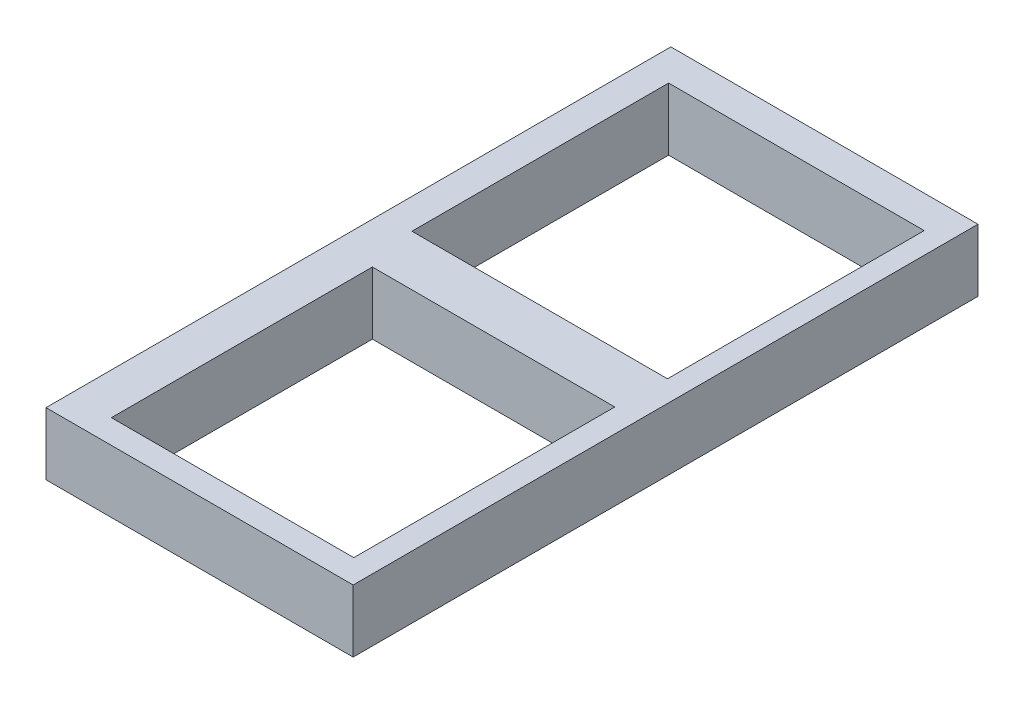
ISO-10303-21;
HEADER;
FILE_DESCRIPTION(('STEP AP214'),'2;1');
FILE_NAME('part.step','',(''),(''),'','','');
FILE_SCHEMA(('AUTOMOTIVE_DESIGN { 1 0 10303 214 1 1 1 1 }'));
ENDSEC;
DATA;
#1=APPLICATION_CONTEXT('core data for automotive mechanical design processes');
#2=APPLICATION_PROTOCOL_DEFINITION('international standard','automotive_design',2000,#1);
#3=PRODUCT_CONTEXT('',#1,'mechanical');
#4=PRODUCT('Part','Part','',(#3));
#5=PRODUCT_RELATED_PRODUCT_CATEGORY('part','',(#4));
#6=PRODUCT_DEFINITION_FORMATION('','',#4);
#7=PRODUCT_DEFINITION_CONTEXT('part definition',#1,'design');
#8=PRODUCT_DEFINITION('design','',#6,#7);
#9=PRODUCT_DEFINITION_SHAPE('','',#8);
#10=(LENGTH_UNIT() NAMED_UNIT(*) SI_UNIT(.MILLI.,.METRE.));
#11=(NAMED_UNIT(*) PLANE_ANGLE_UNIT() SI_UNIT($,.RADIAN.));
#12=(NAMED_UNIT(*) SI_UNIT($,.STERADIAN.) SOLID_ANGLE_UNIT());
#13=UNCERTAINTY_MEASURE_WITH_UNIT(LENGTH_MEASURE(1.E-05),#10,'distance_accuracy_value','');
#14=(GEOMETRIC_REPRESENTATION_CONTEXT(3) GLOBAL_UNCERTAINTY_ASSIGNED_CONTEXT((#13)) GLOBAL_UNIT_ASSIGNED_CONTEXT((#10,
#11,#12)) REPRESENTATION_CONTEXT('',''));
#15=CARTESIAN_POINT('',(0.,0.,0.));
#16=DIRECTION('',(0.,0.,1.));
#17=DIRECTION('',(1.,0.,0.));
#18=AXIS2_PLACEMENT_3D('',#15,#16,#17);
#19=CARTESIAN_POINT('',(24.5775296203242,10.,-50.));
#20=DIRECTION('',(-1.,0.,0.));
#21=DIRECTION('',(0.,0.,1.));
#22=AXIS2_PLACEMENT_3D('',#19,#20,#21);
#23=PLANE('',#22);
#24=DIRECTION('',(0.,0.,-1.));
#25=VECTOR('',#24,1.);
#26=CARTESIAN_POINT('',(24.5775296203242,0.,-50.));
#27=LINE('',#26,#25);
#28=CARTESIAN_POINT('',(24.5775296203242,0.,50.));
#29=VERTEX_POINT('',#28);
#30=CARTESIAN_POINT('',(24.5775296203242,0.,-50.));
#31=VERTEX_POINT('',#30);
#32=EDGE_CURVE('E158',#29,#31,#27,.T.);
#33=ORIENTED_EDGE('',*,*,#32,.T.);
#34=DIRECTION('',(0.,-1.,0.));
#35=VECTOR('',#34,1.);
#36=CARTESIAN_POINT('',(24.5775296203242,10.,-50.));
#37=LINE('',#36,#35);
#38=CARTESIAN_POINT('',(24.5775296203242,10.,-50.));
#39=VERTEX_POINT('',#38);
#40=EDGE_CURVE('E11',#39,#31,#37,.T.);
#41=ORIENTED_EDGE('',*,*,#40,.F.);
#42=DIRECTION('',(0.,0.,-1.));
#43=VECTOR('',#42,1.);
#44=CARTESIAN_POINT('',(24.5775296203242,10.,-50.));
#45=LINE('',#44,#43);
#46=CARTESIAN_POINT('',(24.5775296203242,10.,50.));
#47=VERTEX_POINT('',#46);
#48=EDGE_CURVE('E191',#47,#39,#45,.T.);
#49=ORIENTED_EDGE('',*,*,#48,.F.);
#50=DIRECTION('',(0.,-1.,0.));
#51=VECTOR('',#50,1.);
#52=CARTESIAN_POINT('',(24.5775296203242,10.,50.));
#53=LINE('',#52,#51);
#54=EDGE_CURVE('E201',#47,#29,#53,.T.);
#55=ORIENTED_EDGE('',*,*,#54,.T.);
#56=EDGE_LOOP('',(#33,#41,#49,#55));
#57=FACE_BOUND('',#56,.T.);
#58=ADVANCED_FACE('F32',(#57),#23,.F.);
#59=CARTESIAN_POINT('',(-24.5775296203242,10.,-50.));
#60=DIRECTION('',(0.,0.,1.));
#61=DIRECTION('',(1.,0.,0.));
#62=AXIS2_PLACEMENT_3D('',#59,#60,#61);
#63=PLANE('',#62);
#64=DIRECTION('',(-1.,0.,0.));
#65=VECTOR('',#64,1.);
#66=CARTESIAN_POINT('',(-24.5775296203242,0.,-50.));
#67=LINE('',#66,#65);
#68=CARTESIAN_POINT('',(-24.5775296203242,0.,-50.));
#69=VERTEX_POINT('',#68);
#70=EDGE_CURVE('E204',#31,#69,#67,.T.);
#71=ORIENTED_EDGE('',*,*,#70,.T.);
#72=DIRECTION('',(0.,-1.,0.));
#73=VECTOR('',#72,1.);
#74=CARTESIAN_POINT('',(-24.5775296203242,10.,-50.));
#75=LINE('',#74,#73);
#76=CARTESIAN_POINT('',(-24.5775296203242,10.,-50.));
#77=VERTEX_POINT('',#76);
#78=EDGE_CURVE('E39',#77,#69,#75,.T.);
#79=ORIENTED_EDGE('',*,*,#78,.F.);
#80=DIRECTION('',(-1.,0.,0.));
#81=VECTOR('',#80,1.);
#82=CARTESIAN_POINT('',(-24.5775296203242,10.,-50.));
#83=LINE('',#82,#81);
#84=EDGE_CURVE('E194',#39,#77,#83,.T.);
#85=ORIENTED_EDGE('',*,*,#84,.F.);
#86=ORIENTED_EDGE('',*,*,#40,.T.);
#87=EDGE_LOOP('',(#71,#79,#85,#86));
#88=FACE_BOUND('',#87,.T.);
#89=ADVANCED_FACE('F233',(#88),#63,.F.);
#90=CARTESIAN_POINT('',(-24.5775296203242,10.,-50.));
#91=DIRECTION('',(1.,0.,0.));
#92=DIRECTION('',(0.,0.,-1.));
#93=AXIS2_PLACEMENT_3D('',#90,#91,#92);
#94=PLANE('',#93);
#95=DIRECTION('',(0.,0.,1.));
#96=VECTOR('',#95,1.);
#97=CARTESIAN_POINT('',(-24.5775296203242,0.,-50.));
#98=LINE('',#97,#96);
#99=CARTESIAN_POINT('',(-24.5775296203242,0.,50.));
#100=VERTEX_POINT('',#99);
#101=EDGE_CURVE('E206',#69,#100,#98,.T.);
#102=ORIENTED_EDGE('',*,*,#101,.T.);
#103=DIRECTION('',(0.,-1.,0.));
#104=VECTOR('',#103,1.);
#105=CARTESIAN_POINT('',(-24.5775296203242,10.,50.));
#106=LINE('',#105,#104);
#107=CARTESIAN_POINT('',(-24.5775296203242,10.,50.));
#108=VERTEX_POINT('',#107);
#109=EDGE_CURVE('E211',#108,#100,#106,.T.);
#110=ORIENTED_EDGE('',*,*,#109,.F.);
#111=DIRECTION('',(0.,0.,1.));
#112=VECTOR('',#111,1.);
#113=CARTESIAN_POINT('',(-24.5775296203242,10.,-50.));
#114=LINE('',#113,#112);
#115=EDGE_CURVE('E197',#77,#108,#114,.T.);
#116=ORIENTED_EDGE('',*,*,#115,.F.);
#117=ORIENTED_EDGE('',*,*,#78,.T.);
#118=EDGE_LOOP('',(#102,#110,#116,#117));
#119=FACE_BOUND('',#118,.T.);
#120=ADVANCED_FACE('F218',(#119),#94,.F.);
#121=CARTESIAN_POINT('',(-24.5775296203242,10.,50.));
#122=DIRECTION('',(0.,0.,-1.));
#123=DIRECTION('',(-1.,0.,0.));
#124=AXIS2_PLACEMENT_3D('',#121,#122,#123);
#125=PLANE('',#124);
#126=DIRECTION('',(1.,0.,0.));
#127=VECTOR('',#126,1.);
#128=CARTESIAN_POINT('',(-24.5775296203242,0.,50.));
#129=LINE('',#128,#127);
#130=EDGE_CURVE('E195',#100,#29,#129,.T.);
#131=ORIENTED_EDGE('',*,*,#130,.T.);
#132=ORIENTED_EDGE('',*,*,#54,.F.);
#133=DIRECTION('',(1.,0.,0.));
#134=VECTOR('',#133,1.);
#135=CARTESIAN_POINT('',(-24.5775296203242,10.,50.));
#136=LINE('',#135,#134);
#137=EDGE_CURVE('E199',#108,#47,#136,.T.);
#138=ORIENTED_EDGE('',*,*,#137,.F.);
#139=ORIENTED_EDGE('',*,*,#109,.T.);
#140=EDGE_LOOP('',(#131,#132,#138,#139));
#141=FACE_BOUND('',#140,.T.);
#142=ADVANCED_FACE('F227',(#141),#125,.F.);
#143=CARTESIAN_POINT('',(0.,10.,0.));
#144=DIRECTION('',(0.,1.,0.));
#145=DIRECTION('',(0.,0.,1.));
#146=AXIS2_PLACEMENT_3D('',#143,#144,#145);
#147=PLANE('',#146);
#148=DIRECTION('',(0.,0.,-1.));
#149=VECTOR('',#148,1.);
#150=CARTESIAN_POINT('',(-19.7443156520478,10.,-44.8094414734612));
#151=LINE('',#150,#149);
#152=CARTESIAN_POINT('',(-19.7443156520478,10.,-3.72946128702267));
#153=VERTEX_POINT('',#152);
#154=CARTESIAN_POINT('',(-19.7443156520478,10.,-44.8094414734612));
#155=VERTEX_POINT('',#154);
#156=EDGE_CURVE('E124',#153,#155,#151,.T.);
#157=ORIENTED_EDGE('',*,*,#156,.T.);
#158=DIRECTION('',(1.,0.,0.));
#159=VECTOR('',#158,1.);
#160=CARTESIAN_POINT('',(21.155280696604,10.,-44.8094414734612));
#161=LINE('',#160,#159);
#162=CARTESIAN_POINT('',(21.155280696604,10.,-44.8094414734612));
#163=VERTEX_POINT('',#162);
#164=EDGE_CURVE('E135',#155,#163,#161,.T.);
#165=ORIENTED_EDGE('',*,*,#164,.T.);
#166=DIRECTION('',(0.,0.,1.));
#167=VECTOR('',#166,1.);
#168=CARTESIAN_POINT('',(21.155280696604,10.,-44.8094414734612));
#169=LINE('',#168,#167);
#170=CARTESIAN_POINT('',(21.155280696604,10.,-3.72946128702267));
#171=VERTEX_POINT('',#170);
#172=EDGE_CURVE('E46',#163,#171,#169,.T.);
#173=ORIENTED_EDGE('',*,*,#172,.T.);
#174=DIRECTION('',(-1.,0.,0.));
#175=VECTOR('',#174,1.);
#176=CARTESIAN_POINT('',(21.155280696604,10.,-3.72946128702267));
#177=LINE('',#176,#175);
#178=EDGE_CURVE('E132',#171,#153,#177,.T.);
#179=ORIENTED_EDGE('',*,*,#178,.T.);
#180=EDGE_LOOP('',(#157,#165,#173,#179));
#181=FACE_BOUND('',#180,.T.);
#182=DIRECTION('',(0.,0.,-1.));
#183=VECTOR('',#182,1.);
#184=CARTESIAN_POINT('',(-17.9532623370164,10.,4.3908592135864));
#185=LINE('',#184,#183);
#186=CARTESIAN_POINT('',(-17.9532623370164,10.,46.157022605243));
#187=VERTEX_POINT('',#186);
#188=CARTESIAN_POINT('',(-17.9532623370164,10.,4.3908592135864));
#189=VERTEX_POINT('',#188);
#190=EDGE_CURVE('E162',#187,#189,#185,.T.);
#191=ORIENTED_EDGE('',*,*,#190,.T.);
#192=DIRECTION('',(1.,0.,0.));
#193=VECTOR('',#192,1.);
#194=CARTESIAN_POINT('',(20.8404441696644,10.,4.3908592135864));
#195=LINE('',#194,#193);
#196=CARTESIAN_POINT('',(20.8404441696644,10.,4.3908592135864));
#197=VERTEX_POINT('',#196);
#198=EDGE_CURVE('E165',#189,#197,#195,.T.);
#199=ORIENTED_EDGE('',*,*,#198,.T.);
#200=DIRECTION('',(0.,0.,1.));
#201=VECTOR('',#200,1.);
#202=CARTESIAN_POINT('',(20.8404441696644,10.,4.3908592135864));
#203=LINE('',#202,#201);
#204=CARTESIAN_POINT('',(20.8404441696643,10.,46.157022605243));
#205=VERTEX_POINT('',#204);
#206=EDGE_CURVE('E54',#197,#205,#203,.T.);
#207=ORIENTED_EDGE('',*,*,#206,.T.);
#208=DIRECTION('',(-1.,0.,0.));
#209=VECTOR('',#208,1.);
#210=CARTESIAN_POINT('',(20.8404441696643,10.,46.157022605243));
#211=LINE('',#210,#209);
#212=EDGE_CURVE('E170',#205,#187,#211,.T.);
#213=ORIENTED_EDGE('',*,*,#212,.T.);
#214=EDGE_LOOP('',(#191,#199,#207,#213));
#215=FACE_BOUND('',#214,.T.);
#216=ORIENTED_EDGE('',*,*,#48,.T.);
#217=ORIENTED_EDGE('',*,*,#84,.T.);
#218=ORIENTED_EDGE('',*,*,#115,.T.);
#219=ORIENTED_EDGE('',*,*,#137,.T.);
#220=EDGE_LOOP('',(#216,#217,#218,#219));
#221=FACE_BOUND('',#220,.T.);
#222=ADVANCED_FACE('F139',(#181,#215,#221),#147,.T.);
#223=CARTESIAN_POINT('',(0.,0.,0.));
#224=DIRECTION('',(0.,1.,0.));
#225=DIRECTION('',(0.,0.,1.));
#226=AXIS2_PLACEMENT_3D('',#223,#224,#225);
#227=PLANE('',#226);
#228=DIRECTION('',(1.,0.,0.));
#229=VECTOR('',#228,1.);
#230=CARTESIAN_POINT('',(21.155280696604,0.,-44.8094414734612));
#231=LINE('',#230,#229);
#232=CARTESIAN_POINT('',(-19.7443156520478,0.,-44.8094414734612));
#233=VERTEX_POINT('',#232);
#234=CARTESIAN_POINT('',(21.155280696604,0.,-44.8094414734612));
#235=VERTEX_POINT('',#234);
#236=EDGE_CURVE('E151',#233,#235,#231,.T.);
#237=ORIENTED_EDGE('',*,*,#236,.F.);
#238=DIRECTION('',(0.,0.,-1.));
#239=VECTOR('',#238,1.);
#240=CARTESIAN_POINT('',(-19.7443156520478,0.,-44.8094414734612));
#241=LINE('',#240,#239);
#242=CARTESIAN_POINT('',(-19.7443156520478,0.,-3.72946128702267));
#243=VERTEX_POINT('',#242);
#244=EDGE_CURVE('E127',#243,#233,#241,.T.);
#245=ORIENTED_EDGE('',*,*,#244,.F.);
#246=DIRECTION('',(-1.,0.,0.));
#247=VECTOR('',#246,1.);
#248=CARTESIAN_POINT('',(21.155280696604,0.,-3.72946128702267));
#249=LINE('',#248,#247);
#250=CARTESIAN_POINT('',(21.155280696604,0.,-3.72946128702267));
#251=VERTEX_POINT('',#250);
#252=EDGE_CURVE('E142',#251,#243,#249,.T.);
#253=ORIENTED_EDGE('',*,*,#252,.F.);
#254=DIRECTION('',(0.,0.,1.));
#255=VECTOR('',#254,1.);
#256=CARTESIAN_POINT('',(21.155280696604,0.,-44.8094414734612));
#257=LINE('',#256,#255);
#258=EDGE_CURVE('E145',#235,#251,#257,.T.);
#259=ORIENTED_EDGE('',*,*,#258,.F.);
#260=EDGE_LOOP('',(#237,#245,#253,#259));
#261=FACE_BOUND('',#260,.T.);
#262=DIRECTION('',(1.,0.,0.));
#263=VECTOR('',#262,1.);
#264=CARTESIAN_POINT('',(20.8404441696644,0.,4.3908592135864));
#265=LINE('',#264,#263);
#266=CARTESIAN_POINT('',(-17.9532623370164,0.,4.3908592135864));
#267=VERTEX_POINT('',#266);
#268=CARTESIAN_POINT('',(20.8404441696644,0.,4.3908592135864));
#269=VERTEX_POINT('',#268);
#270=EDGE_CURVE('E176',#267,#269,#265,.T.);
#271=ORIENTED_EDGE('',*,*,#270,.F.);
#272=DIRECTION('',(0.,0.,-1.));
#273=VECTOR('',#272,1.);
#274=CARTESIAN_POINT('',(-17.9532623370164,0.,4.3908592135864));
#275=LINE('',#274,#273);
#276=CARTESIAN_POINT('',(-17.9532623370164,0.,46.157022605243));
#277=VERTEX_POINT('',#276);
#278=EDGE_CURVE('E174',#277,#267,#275,.T.);
#279=ORIENTED_EDGE('',*,*,#278,.F.);
#280=DIRECTION('',(-1.,0.,0.));
#281=VECTOR('',#280,1.);
#282=CARTESIAN_POINT('',(20.8404441696643,0.,46.157022605243));
#283=LINE('',#282,#281);
#284=CARTESIAN_POINT('',(20.8404441696643,0.,46.157022605243));
#285=VERTEX_POINT('',#284);
#286=EDGE_CURVE('E166',#285,#277,#283,.T.);
#287=ORIENTED_EDGE('',*,*,#286,.F.);
#288=DIRECTION('',(0.,0.,1.));
#289=VECTOR('',#288,1.);
#290=CARTESIAN_POINT('',(20.8404441696644,0.,4.3908592135864));
#291=LINE('',#290,#289);
#292=EDGE_CURVE('E179',#269,#285,#291,.T.);
#293=ORIENTED_EDGE('',*,*,#292,.F.);
#294=EDGE_LOOP('',(#271,#279,#287,#293));
#295=FACE_BOUND('',#294,.T.);
#296=ORIENTED_EDGE('',*,*,#32,.F.);
#297=ORIENTED_EDGE('',*,*,#130,.F.);
#298=ORIENTED_EDGE('',*,*,#101,.F.);
#299=ORIENTED_EDGE('',*,*,#70,.F.);
#300=EDGE_LOOP('',(#296,#297,#298,#299));
#301=FACE_BOUND('',#300,.T.);
#302=ADVANCED_FACE('F224',(#261,#295,#301),#227,.F.);
#303=CARTESIAN_POINT('',(-17.9532623370164,10.,4.3908592135864));
#304=DIRECTION('',(-1.,0.,0.));
#305=DIRECTION('',(0.,0.,1.));
#306=AXIS2_PLACEMENT_3D('',#303,#304,#305);
#307=PLANE('',#306);
#308=ORIENTED_EDGE('',*,*,#278,.T.);
#309=DIRECTION('',(0.,-1.,0.));
#310=VECTOR('',#309,1.);
#311=CARTESIAN_POINT('',(-17.9532623370164,10.,4.3908592135864));
#312=LINE('',#311,#310);
#313=EDGE_CURVE('E173',#189,#267,#312,.T.);
#314=ORIENTED_EDGE('',*,*,#313,.F.);
#315=ORIENTED_EDGE('',*,*,#190,.F.);
#316=DIRECTION('',(0.,-1.,0.));
#317=VECTOR('',#316,1.);
#318=CARTESIAN_POINT('',(-17.9532623370164,10.,46.157022605243));
#319=LINE('',#318,#317);
#320=EDGE_CURVE('E152',#187,#277,#319,.T.);
#321=ORIENTED_EDGE('',*,*,#320,.T.);
#322=EDGE_LOOP('',(#308,#314,#315,#321));
#323=FACE_BOUND('',#322,.T.);
#324=ADVANCED_FACE('F245',(#323),#307,.F.);
#325=CARTESIAN_POINT('',(20.8404441696643,10.,46.157022605243));
#326=DIRECTION('',(0.,0.,1.));
#327=DIRECTION('',(1.,0.,0.));
#328=AXIS2_PLACEMENT_3D('',#325,#326,#327);
#329=PLANE('',#328);
#330=ORIENTED_EDGE('',*,*,#286,.T.);
#331=ORIENTED_EDGE('',*,*,#320,.F.);
#332=ORIENTED_EDGE('',*,*,#212,.F.);
#333=DIRECTION('',(0.,-1.,0.));
#334=VECTOR('',#333,1.);
#335=CARTESIAN_POINT('',(20.8404441696643,10.,46.157022605243));
#336=LINE('',#335,#334);
#337=EDGE_CURVE('E185',#205,#285,#336,.T.);
#338=ORIENTED_EDGE('',*,*,#337,.T.);
#339=EDGE_LOOP('',(#330,#331,#332,#338));
#340=FACE_BOUND('',#339,.T.);
#341=ADVANCED_FACE('F251',(#340),#329,.F.);
#342=CARTESIAN_POINT('',(20.8404441696644,10.,4.3908592135864));
#343=DIRECTION('',(1.,0.,0.));
#344=DIRECTION('',(0.,0.,-1.));
#345=AXIS2_PLACEMENT_3D('',#342,#343,#344);
#346=PLANE('',#345);
#347=ORIENTED_EDGE('',*,*,#292,.T.);
#348=ORIENTED_EDGE('',*,*,#337,.F.);
#349=ORIENTED_EDGE('',*,*,#206,.F.);
#350=DIRECTION('',(0.,-1.,0.));
#351=VECTOR('',#350,1.);
#352=CARTESIAN_POINT('',(20.8404441696644,10.,4.3908592135864));
#353=LINE('',#352,#351);
#354=EDGE_CURVE('E187',#197,#269,#353,.T.);
#355=ORIENTED_EDGE('',*,*,#354,.T.);
#356=EDGE_LOOP('',(#347,#348,#349,#355));
#357=FACE_BOUND('',#356,.T.);
#358=ADVANCED_FACE('F256',(#357),#346,.F.);
#359=CARTESIAN_POINT('',(20.8404441696644,10.,4.3908592135864));
#360=DIRECTION('',(0.,0.,-1.));
#361=DIRECTION('',(-1.,0.,0.));
#362=AXIS2_PLACEMENT_3D('',#359,#360,#361);
#363=PLANE('',#362);
#364=ORIENTED_EDGE('',*,*,#270,.T.);
#365=ORIENTED_EDGE('',*,*,#354,.F.);
#366=ORIENTED_EDGE('',*,*,#198,.F.);
#367=ORIENTED_EDGE('',*,*,#313,.T.);
#368=EDGE_LOOP('',(#364,#365,#366,#367));
#369=FACE_BOUND('',#368,.T.);
#370=ADVANCED_FACE('F253',(#369),#363,.F.);
#371=CARTESIAN_POINT('',(-19.7443156520478,10.,-44.8094414734612));
#372=DIRECTION('',(-1.,0.,0.));
#373=DIRECTION('',(0.,0.,1.));
#374=AXIS2_PLACEMENT_3D('',#371,#372,#373);
#375=PLANE('',#374);
#376=ORIENTED_EDGE('',*,*,#244,.T.);
#377=DIRECTION('',(0.,-1.,0.));
#378=VECTOR('',#377,1.);
#379=CARTESIAN_POINT('',(-19.7443156520478,10.,-44.8094414734612));
#380=LINE('',#379,#378);
#381=EDGE_CURVE('E120',#155,#233,#380,.T.);
#382=ORIENTED_EDGE('',*,*,#381,.F.);
#383=ORIENTED_EDGE('',*,*,#156,.F.);
#384=DIRECTION('',(0.,-1.,0.));
#385=VECTOR('',#384,1.);
#386=CARTESIAN_POINT('',(-19.7443156520478,10.,-3.72946128702267));
#387=LINE('',#386,#385);
#388=EDGE_CURVE('E156',#153,#243,#387,.T.);
#389=ORIENTED_EDGE('',*,*,#388,.T.);
#390=EDGE_LOOP('',(#376,#382,#383,#389));
#391=FACE_BOUND('',#390,.T.);
#392=ADVANCED_FACE('F122',(#391),#375,.F.);
#393=CARTESIAN_POINT('',(21.155280696604,10.,-3.72946128702267));
#394=DIRECTION('',(0.,0.,1.));
#395=DIRECTION('',(1.,0.,0.));
#396=AXIS2_PLACEMENT_3D('',#393,#394,#395);
#397=PLANE('',#396);
#398=ORIENTED_EDGE('',*,*,#252,.T.);
#399=ORIENTED_EDGE('',*,*,#388,.F.);
#400=ORIENTED_EDGE('',*,*,#178,.F.);
#401=DIRECTION('',(0.,-1.,0.));
#402=VECTOR('',#401,1.);
#403=CARTESIAN_POINT('',(21.155280696604,10.,-3.72946128702267));
#404=LINE('',#403,#402);
#405=EDGE_CURVE('E159',#171,#251,#404,.T.);
#406=ORIENTED_EDGE('',*,*,#405,.T.);
#407=EDGE_LOOP('',(#398,#399,#400,#406));
#408=FACE_BOUND('',#407,.T.);
#409=ADVANCED_FACE('F265',(#408),#397,.F.);
#410=CARTESIAN_POINT('',(21.155280696604,10.,-44.8094414734612));
#411=DIRECTION('',(1.,0.,0.));
#412=DIRECTION('',(0.,0.,-1.));
#413=AXIS2_PLACEMENT_3D('',#410,#411,#412);
#414=PLANE('',#413);
#415=ORIENTED_EDGE('',*,*,#258,.T.);
#416=ORIENTED_EDGE('',*,*,#405,.F.);
#417=ORIENTED_EDGE('',*,*,#172,.F.);
#418=DIRECTION('',(0.,-1.,0.));
#419=VECTOR('',#418,1.);
#420=CARTESIAN_POINT('',(21.155280696604,10.,-44.8094414734612));
#421=LINE('',#420,#419);
#422=EDGE_CURVE('E131',#163,#235,#421,.T.);
#423=ORIENTED_EDGE('',*,*,#422,.T.);
#424=EDGE_LOOP('',(#415,#416,#417,#423));
#425=FACE_BOUND('',#424,.T.);
#426=ADVANCED_FACE('F268',(#425),#414,.F.);
#427=CARTESIAN_POINT('',(21.155280696604,10.,-44.8094414734612));
#428=DIRECTION('',(0.,0.,-1.));
#429=DIRECTION('',(-1.,0.,0.));
#430=AXIS2_PLACEMENT_3D('',#427,#428,#429);
#431=PLANE('',#430);
#432=ORIENTED_EDGE('',*,*,#236,.T.);
#433=ORIENTED_EDGE('',*,*,#422,.F.);
#434=ORIENTED_EDGE('',*,*,#164,.F.);
#435=ORIENTED_EDGE('',*,*,#381,.T.);
#436=EDGE_LOOP('',(#432,#433,#434,#435));
#437=FACE_BOUND('',#436,.T.);
#438=ADVANCED_FACE('F136',(#437),#431,.F.);
#439=CLOSED_SHELL('',(#58,#89,#120,#142,#222,#302,#324,#341,#358,#370,#392,#409,#426,#438));
#440=MANIFOLD_SOLID_BREP('B2',#439);
#441=ADVANCED_BREP_SHAPE_REPRESENTATION('',(#18,#440),#14);
#442=SHAPE_DEFINITION_REPRESENTATION(#9,#441);
ENDSEC;
END-ISO-10303-21;
